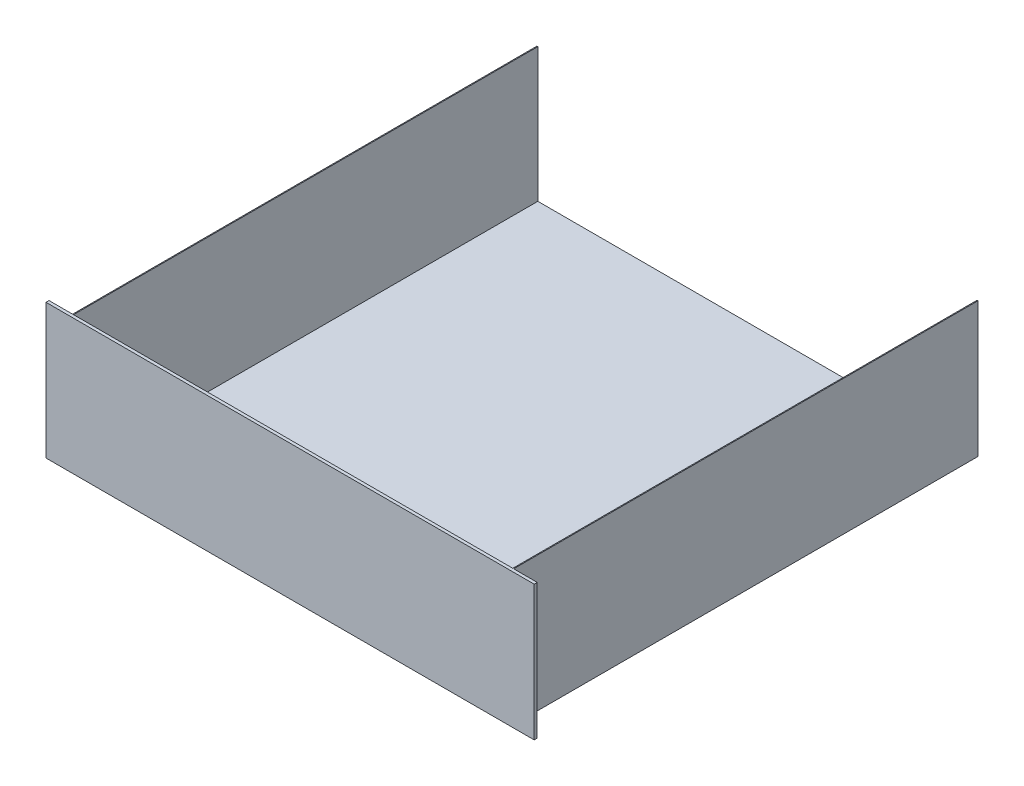
ISO-10303-21;
HEADER;
FILE_DESCRIPTION(('STEP AP214'),'2;1');
FILE_NAME('part.step','',(''),(''),'','','');
FILE_SCHEMA(('AUTOMOTIVE_DESIGN { 1 0 10303 214 1 1 1 1 }'));
ENDSEC;
DATA;
#1=APPLICATION_CONTEXT('core data for automotive mechanical design processes');
#2=APPLICATION_PROTOCOL_DEFINITION('international standard','automotive_design',2000,#1);
#3=PRODUCT_CONTEXT('',#1,'mechanical');
#4=PRODUCT('Part','Part','',(#3));
#5=PRODUCT_RELATED_PRODUCT_CATEGORY('part','',(#4));
#6=PRODUCT_DEFINITION_FORMATION('','',#4);
#7=PRODUCT_DEFINITION_CONTEXT('part definition',#1,'design');
#8=PRODUCT_DEFINITION('design','',#6,#7);
#9=PRODUCT_DEFINITION_SHAPE('','',#8);
#10=(LENGTH_UNIT() NAMED_UNIT(*) SI_UNIT(.MILLI.,.METRE.));
#11=(NAMED_UNIT(*) PLANE_ANGLE_UNIT() SI_UNIT($,.RADIAN.));
#12=(NAMED_UNIT(*) SI_UNIT($,.STERADIAN.) SOLID_ANGLE_UNIT());
#13=UNCERTAINTY_MEASURE_WITH_UNIT(LENGTH_MEASURE(1.E-05),#10,'distance_accuracy_value','');
#14=(GEOMETRIC_REPRESENTATION_CONTEXT(3) GLOBAL_UNCERTAINTY_ASSIGNED_CONTEXT((#13)) GLOBAL_UNIT_ASSIGNED_CONTEXT((#10,
#11,#12)) REPRESENTATION_CONTEXT('',''));
#15=CARTESIAN_POINT('',(0.,0.,0.));
#16=DIRECTION('',(0.,0.,1.));
#17=DIRECTION('',(1.,0.,0.));
#18=AXIS2_PLACEMENT_3D('',#15,#16,#17);
#19=CARTESIAN_POINT('',(0.,0.,0.));
#20=DIRECTION('',(0.,0.,1.));
#21=DIRECTION('',(1.,0.,0.));
#22=AXIS2_PLACEMENT_3D('',#19,#20,#21);
#23=PLANE('',#22);
#24=DIRECTION('',(0.,1.,0.));
#25=VECTOR('',#24,1.);
#26=CARTESIAN_POINT('',(217.1,66.675,0.));
#27=LINE('',#26,#25);
#28=CARTESIAN_POINT('',(217.1,-65.775,0.));
#29=VERTEX_POINT('',#28);
#30=CARTESIAN_POINT('',(217.1,66.675,0.));
#31=VERTEX_POINT('',#30);
#32=EDGE_CURVE('E56',#29,#31,#27,.T.);
#33=ORIENTED_EDGE('',*,*,#32,.F.);
#34=DIRECTION('',(1.,0.,0.));
#35=VECTOR('',#34,1.);
#36=CARTESIAN_POINT('',(217.1,-65.775,0.));
#37=LINE('',#36,#35);
#38=CARTESIAN_POINT('',(-217.1,-65.775,0.));
#39=VERTEX_POINT('',#38);
#40=EDGE_CURVE('E60',#39,#29,#37,.T.);
#41=ORIENTED_EDGE('',*,*,#40,.F.);
#42=DIRECTION('',(0.,-1.,0.));
#43=VECTOR('',#42,1.);
#44=CARTESIAN_POINT('',(-217.1,-65.775,0.));
#45=LINE('',#44,#43);
#46=CARTESIAN_POINT('',(-217.1,66.675,0.));
#47=VERTEX_POINT('',#46);
#48=EDGE_CURVE('E254',#47,#39,#45,.T.);
#49=ORIENTED_EDGE('',*,*,#48,.F.);
#50=DIRECTION('',(-1.,0.,0.));
#51=VECTOR('',#50,1.);
#52=CARTESIAN_POINT('',(-241.3,66.675,0.));
#53=LINE('',#52,#51);
#54=EDGE_CURVE('E208',#31,#47,#53,.T.);
#55=ORIENTED_EDGE('',*,*,#54,.F.);
#56=EDGE_LOOP('',(#33,#41,#49,#55));
#57=FACE_BOUND('',#56,.T.);
#58=ADVANCED_FACE('F39',(#57),#23,.F.);
#59=DIRECTION('',(0.,1.,0.));
#60=VECTOR('',#59,1.);
#61=CARTESIAN_POINT('',(-218.,-66.675,0.));
#62=LINE('',#61,#60);
#63=CARTESIAN_POINT('',(-218.,-66.675,0.));
#64=VERTEX_POINT('',#63);
#65=CARTESIAN_POINT('',(-218.,66.675,0.));
#66=VERTEX_POINT('',#65);
#67=EDGE_CURVE('E253',#64,#66,#62,.T.);
#68=ORIENTED_EDGE('',*,*,#67,.F.);
#69=DIRECTION('',(1.,0.,0.));
#70=VECTOR('',#69,1.);
#71=CARTESIAN_POINT('',(-241.3,-66.675,0.));
#72=LINE('',#71,#70);
#73=CARTESIAN_POINT('',(-241.3,-66.675,0.));
#74=VERTEX_POINT('',#73);
#75=EDGE_CURVE('E189',#74,#64,#72,.T.);
#76=ORIENTED_EDGE('',*,*,#75,.F.);
#77=DIRECTION('',(0.,-1.,0.));
#78=VECTOR('',#77,1.);
#79=CARTESIAN_POINT('',(-241.3,66.675,0.));
#80=LINE('',#79,#78);
#81=CARTESIAN_POINT('',(-241.3,66.675,0.));
#82=VERTEX_POINT('',#81);
#83=EDGE_CURVE('E199',#82,#74,#80,.T.);
#84=ORIENTED_EDGE('',*,*,#83,.F.);
#85=EDGE_CURVE('E160',#66,#82,#53,.T.);
#86=ORIENTED_EDGE('',*,*,#85,.F.);
#87=EDGE_LOOP('',(#68,#76,#84,#86));
#88=FACE_BOUND('',#87,.T.);
#89=ADVANCED_FACE('F231',(#88),#23,.F.);
#90=DIRECTION('',(0.,-1.,0.));
#91=VECTOR('',#90,1.);
#92=CARTESIAN_POINT('',(218.,66.675,0.));
#93=LINE('',#92,#91);
#94=CARTESIAN_POINT('',(218.,66.675,0.));
#95=VERTEX_POINT('',#94);
#96=CARTESIAN_POINT('',(218.,-66.675,0.));
#97=VERTEX_POINT('',#96);
#98=EDGE_CURVE('E252',#95,#97,#93,.T.);
#99=ORIENTED_EDGE('',*,*,#98,.F.);
#100=CARTESIAN_POINT('',(241.3,66.675,0.));
#101=VERTEX_POINT('',#100);
#102=EDGE_CURVE('E156',#101,#95,#53,.T.);
#103=ORIENTED_EDGE('',*,*,#102,.F.);
#104=DIRECTION('',(0.,1.,0.));
#105=VECTOR('',#104,1.);
#106=CARTESIAN_POINT('',(241.3,66.675,0.));
#107=LINE('',#106,#105);
#108=CARTESIAN_POINT('',(241.3,-66.675,0.));
#109=VERTEX_POINT('',#108);
#110=EDGE_CURVE('E157',#109,#101,#107,.T.);
#111=ORIENTED_EDGE('',*,*,#110,.F.);
#112=EDGE_CURVE('E209',#97,#109,#72,.T.);
#113=ORIENTED_EDGE('',*,*,#112,.F.);
#114=EDGE_LOOP('',(#99,#103,#111,#113));
#115=FACE_BOUND('',#114,.T.);
#116=ADVANCED_FACE('F251',(#115),#23,.F.);
#117=CARTESIAN_POINT('',(241.3,66.675,3.));
#118=DIRECTION('',(-1.,0.,0.));
#119=DIRECTION('',(0.,-1.,0.));
#120=AXIS2_PLACEMENT_3D('',#117,#118,#119);
#121=PLANE('',#120);
#122=ORIENTED_EDGE('',*,*,#110,.T.);
#123=DIRECTION('',(0.,0.,-1.));
#124=VECTOR('',#123,1.);
#125=CARTESIAN_POINT('',(241.3,66.675,3.));
#126=LINE('',#125,#124);
#127=CARTESIAN_POINT('',(241.3,66.675,3.));
#128=VERTEX_POINT('',#127);
#129=EDGE_CURVE('E11',#128,#101,#126,.T.);
#130=ORIENTED_EDGE('',*,*,#129,.F.);
#131=DIRECTION('',(0.,1.,0.));
#132=VECTOR('',#131,1.);
#133=CARTESIAN_POINT('',(241.3,66.675,3.));
#134=LINE('',#133,#132);
#135=CARTESIAN_POINT('',(241.3,-66.675,3.));
#136=VERTEX_POINT('',#135);
#137=EDGE_CURVE('E185',#136,#128,#134,.T.);
#138=ORIENTED_EDGE('',*,*,#137,.F.);
#139=DIRECTION('',(0.,0.,-1.));
#140=VECTOR('',#139,1.);
#141=CARTESIAN_POINT('',(241.3,-66.675,3.));
#142=LINE('',#141,#140);
#143=EDGE_CURVE('E195',#136,#109,#142,.T.);
#144=ORIENTED_EDGE('',*,*,#143,.T.);
#145=EDGE_LOOP('',(#122,#130,#138,#144));
#146=FACE_BOUND('',#145,.T.);
#147=ADVANCED_FACE('F41',(#146),#121,.F.);
#148=CARTESIAN_POINT('',(-241.3,66.675,3.));
#149=DIRECTION('',(0.,-1.,0.));
#150=DIRECTION('',(0.,0.,-1.));
#151=AXIS2_PLACEMENT_3D('',#148,#149,#150);
#152=PLANE('',#151);
#153=ORIENTED_EDGE('',*,*,#102,.T.);
#154=DIRECTION('',(0.,0.,1.));
#155=VECTOR('',#154,1.);
#156=CARTESIAN_POINT('',(218.,66.675,-459.));
#157=LINE('',#156,#155);
#158=CARTESIAN_POINT('',(218.,66.675,-459.));
#159=VERTEX_POINT('',#158);
#160=EDGE_CURVE('E137',#159,#95,#157,.T.);
#161=ORIENTED_EDGE('',*,*,#160,.F.);
#162=DIRECTION('',(1.,0.,0.));
#163=VECTOR('',#162,1.);
#164=CARTESIAN_POINT('',(218.,66.675,-459.));
#165=LINE('',#164,#163);
#166=CARTESIAN_POINT('',(217.1,66.675,-459.));
#167=VERTEX_POINT('',#166);
#168=EDGE_CURVE('E144',#167,#159,#165,.T.);
#169=ORIENTED_EDGE('',*,*,#168,.F.);
#170=DIRECTION('',(0.,0.,1.));
#171=VECTOR('',#170,1.);
#172=CARTESIAN_POINT('',(217.1,66.675,-459.));
#173=LINE('',#172,#171);
#174=EDGE_CURVE('E171',#167,#31,#173,.T.);
#175=ORIENTED_EDGE('',*,*,#174,.T.);
#176=ORIENTED_EDGE('',*,*,#54,.T.);
#177=DIRECTION('',(0.,0.,1.));
#178=VECTOR('',#177,1.);
#179=CARTESIAN_POINT('',(-217.1,66.675,-459.));
#180=LINE('',#179,#178);
#181=CARTESIAN_POINT('',(-217.1,66.675,-459.));
#182=VERTEX_POINT('',#181);
#183=EDGE_CURVE('E184',#182,#47,#180,.T.);
#184=ORIENTED_EDGE('',*,*,#183,.F.);
#185=DIRECTION('',(1.,0.,0.));
#186=VECTOR('',#185,1.);
#187=CARTESIAN_POINT('',(-217.1,66.675,-459.));
#188=LINE('',#187,#186);
#189=CARTESIAN_POINT('',(-218.,66.675,-459.));
#190=VERTEX_POINT('',#189);
#191=EDGE_CURVE('E278',#190,#182,#188,.T.);
#192=ORIENTED_EDGE('',*,*,#191,.F.);
#193=DIRECTION('',(0.,0.,1.));
#194=VECTOR('',#193,1.);
#195=CARTESIAN_POINT('',(-218.,66.675,-459.));
#196=LINE('',#195,#194);
#197=EDGE_CURVE('E220',#190,#66,#196,.T.);
#198=ORIENTED_EDGE('',*,*,#197,.T.);
#199=ORIENTED_EDGE('',*,*,#85,.T.);
#200=DIRECTION('',(0.,0.,-1.));
#201=VECTOR('',#200,1.);
#202=CARTESIAN_POINT('',(-241.3,66.675,3.));
#203=LINE('',#202,#201);
#204=CARTESIAN_POINT('',(-241.3,66.675,3.));
#205=VERTEX_POINT('',#204);
#206=EDGE_CURVE('E48',#205,#82,#203,.T.);
#207=ORIENTED_EDGE('',*,*,#206,.F.);
#208=DIRECTION('',(-1.,0.,0.));
#209=VECTOR('',#208,1.);
#210=CARTESIAN_POINT('',(-241.3,66.675,3.));
#211=LINE('',#210,#209);
#212=EDGE_CURVE('E188',#128,#205,#211,.T.);
#213=ORIENTED_EDGE('',*,*,#212,.F.);
#214=ORIENTED_EDGE('',*,*,#129,.T.);
#215=EDGE_LOOP('',(#153,#161,#169,#175,#176,#184,#192,#198,#199,#207,#213,#214));
#216=FACE_BOUND('',#215,.T.);
#217=ADVANCED_FACE('F155',(#216),#152,.F.);
#218=CARTESIAN_POINT('',(-241.3,66.675,3.));
#219=DIRECTION('',(1.,0.,0.));
#220=DIRECTION('',(0.,0.,-1.));
#221=AXIS2_PLACEMENT_3D('',#218,#219,#220);
#222=PLANE('',#221);
#223=ORIENTED_EDGE('',*,*,#83,.T.);
#224=DIRECTION('',(0.,0.,-1.));
#225=VECTOR('',#224,1.);
#226=CARTESIAN_POINT('',(-241.3,-66.675,3.));
#227=LINE('',#226,#225);
#228=CARTESIAN_POINT('',(-241.3,-66.675,3.));
#229=VERTEX_POINT('',#228);
#230=EDGE_CURVE('E228',#229,#74,#227,.T.);
#231=ORIENTED_EDGE('',*,*,#230,.F.);
#232=DIRECTION('',(0.,-1.,0.));
#233=VECTOR('',#232,1.);
#234=CARTESIAN_POINT('',(-241.3,66.675,3.));
#235=LINE('',#234,#233);
#236=EDGE_CURVE('E191',#205,#229,#235,.T.);
#237=ORIENTED_EDGE('',*,*,#236,.F.);
#238=ORIENTED_EDGE('',*,*,#206,.T.);
#239=EDGE_LOOP('',(#223,#231,#237,#238));
#240=FACE_BOUND('',#239,.T.);
#241=ADVANCED_FACE('F225',(#240),#222,.F.);
#242=CARTESIAN_POINT('',(-241.3,-66.675,3.));
#243=DIRECTION('',(0.,1.,0.));
#244=DIRECTION('',(0.,0.,1.));
#245=AXIS2_PLACEMENT_3D('',#242,#243,#244);
#246=PLANE('',#245);
#247=ORIENTED_EDGE('',*,*,#75,.T.);
#248=DIRECTION('',(0.,0.,1.));
#249=VECTOR('',#248,1.);
#250=CARTESIAN_POINT('',(-218.,-66.675,-459.));
#251=LINE('',#250,#249);
#252=CARTESIAN_POINT('',(-218.,-66.675,-459.));
#253=VERTEX_POINT('',#252);
#254=EDGE_CURVE('E162',#253,#64,#251,.T.);
#255=ORIENTED_EDGE('',*,*,#254,.F.);
#256=DIRECTION('',(-1.,0.,0.));
#257=VECTOR('',#256,1.);
#258=CARTESIAN_POINT('',(218.,-66.675,-459.));
#259=LINE('',#258,#257);
#260=CARTESIAN_POINT('',(218.,-66.675,-459.));
#261=VERTEX_POINT('',#260);
#262=EDGE_CURVE('E143',#261,#253,#259,.T.);
#263=ORIENTED_EDGE('',*,*,#262,.F.);
#264=DIRECTION('',(0.,0.,1.));
#265=VECTOR('',#264,1.);
#266=CARTESIAN_POINT('',(218.,-66.675,-459.));
#267=LINE('',#266,#265);
#268=EDGE_CURVE('E139',#261,#97,#267,.T.);
#269=ORIENTED_EDGE('',*,*,#268,.T.);
#270=ORIENTED_EDGE('',*,*,#112,.T.);
#271=ORIENTED_EDGE('',*,*,#143,.F.);
#272=DIRECTION('',(1.,0.,0.));
#273=VECTOR('',#272,1.);
#274=CARTESIAN_POINT('',(-241.3,-66.675,3.));
#275=LINE('',#274,#273);
#276=EDGE_CURVE('E193',#229,#136,#275,.T.);
#277=ORIENTED_EDGE('',*,*,#276,.F.);
#278=ORIENTED_EDGE('',*,*,#230,.T.);
#279=EDGE_LOOP('',(#247,#255,#263,#269,#270,#271,#277,#278));
#280=FACE_BOUND('',#279,.T.);
#281=ADVANCED_FACE('F243',(#280),#246,.F.);
#282=CARTESIAN_POINT('',(0.,0.,3.));
#283=DIRECTION('',(0.,0.,1.));
#284=DIRECTION('',(1.,0.,0.));
#285=AXIS2_PLACEMENT_3D('',#282,#283,#284);
#286=PLANE('',#285);
#287=ORIENTED_EDGE('',*,*,#137,.T.);
#288=ORIENTED_EDGE('',*,*,#212,.T.);
#289=ORIENTED_EDGE('',*,*,#236,.T.);
#290=ORIENTED_EDGE('',*,*,#276,.T.);
#291=EDGE_LOOP('',(#287,#288,#289,#290));
#292=FACE_BOUND('',#291,.T.);
#293=ADVANCED_FACE('F246',(#292),#286,.T.);
#294=CARTESIAN_POINT('',(218.,66.675,-459.));
#295=DIRECTION('',(-1.,0.,0.));
#296=DIRECTION('',(0.,-1.,0.));
#297=AXIS2_PLACEMENT_3D('',#294,#295,#296);
#298=PLANE('',#297);
#299=ORIENTED_EDGE('',*,*,#98,.T.);
#300=ORIENTED_EDGE('',*,*,#268,.F.);
#301=DIRECTION('',(0.,-1.,0.));
#302=VECTOR('',#301,1.);
#303=CARTESIAN_POINT('',(218.,66.675,-459.));
#304=LINE('',#303,#302);
#305=EDGE_CURVE('E132',#159,#261,#304,.T.);
#306=ORIENTED_EDGE('',*,*,#305,.F.);
#307=ORIENTED_EDGE('',*,*,#160,.T.);
#308=EDGE_LOOP('',(#299,#300,#306,#307));
#309=FACE_BOUND('',#308,.T.);
#310=ADVANCED_FACE('F135',(#309),#298,.F.);
#311=CARTESIAN_POINT('',(-218.,-66.675,-459.));
#312=DIRECTION('',(1.,0.,0.));
#313=DIRECTION('',(0.,1.,0.));
#314=AXIS2_PLACEMENT_3D('',#311,#312,#313);
#315=PLANE('',#314);
#316=ORIENTED_EDGE('',*,*,#67,.T.);
#317=ORIENTED_EDGE('',*,*,#197,.F.);
#318=DIRECTION('',(0.,1.,0.));
#319=VECTOR('',#318,1.);
#320=CARTESIAN_POINT('',(-218.,-66.675,-459.));
#321=LINE('',#320,#319);
#322=EDGE_CURVE('E273',#253,#190,#321,.T.);
#323=ORIENTED_EDGE('',*,*,#322,.F.);
#324=ORIENTED_EDGE('',*,*,#254,.T.);
#325=EDGE_LOOP('',(#316,#317,#323,#324));
#326=FACE_BOUND('',#325,.T.);
#327=ADVANCED_FACE('F272',(#326),#315,.F.);
#328=CARTESIAN_POINT('',(-217.1,-65.775,-459.));
#329=DIRECTION('',(-1.,0.,0.));
#330=DIRECTION('',(0.,0.,1.));
#331=AXIS2_PLACEMENT_3D('',#328,#329,#330);
#332=PLANE('',#331);
#333=ORIENTED_EDGE('',*,*,#48,.T.);
#334=DIRECTION('',(0.,0.,1.));
#335=VECTOR('',#334,1.);
#336=CARTESIAN_POINT('',(-217.1,-65.775,-459.));
#337=LINE('',#336,#335);
#338=CARTESIAN_POINT('',(-217.1,-65.775,-459.));
#339=VERTEX_POINT('',#338);
#340=EDGE_CURVE('E180',#339,#39,#337,.T.);
#341=ORIENTED_EDGE('',*,*,#340,.F.);
#342=DIRECTION('',(0.,-1.,0.));
#343=VECTOR('',#342,1.);
#344=CARTESIAN_POINT('',(-217.1,-65.775,-459.));
#345=LINE('',#344,#343);
#346=EDGE_CURVE('E282',#182,#339,#345,.T.);
#347=ORIENTED_EDGE('',*,*,#346,.F.);
#348=ORIENTED_EDGE('',*,*,#183,.T.);
#349=EDGE_LOOP('',(#333,#341,#347,#348));
#350=FACE_BOUND('',#349,.T.);
#351=ADVANCED_FACE('F301',(#350),#332,.F.);
#352=CARTESIAN_POINT('',(217.1,-65.775,-459.));
#353=DIRECTION('',(0.,-1.,0.));
#354=DIRECTION('',(0.,0.,-1.));
#355=AXIS2_PLACEMENT_3D('',#352,#353,#354);
#356=PLANE('',#355);
#357=ORIENTED_EDGE('',*,*,#40,.T.);
#358=DIRECTION('',(0.,0.,1.));
#359=VECTOR('',#358,1.);
#360=CARTESIAN_POINT('',(217.1,-65.775,-459.));
#361=LINE('',#360,#359);
#362=CARTESIAN_POINT('',(217.1,-65.775,-459.));
#363=VERTEX_POINT('',#362);
#364=EDGE_CURVE('E177',#363,#29,#361,.T.);
#365=ORIENTED_EDGE('',*,*,#364,.F.);
#366=DIRECTION('',(1.,0.,0.));
#367=VECTOR('',#366,1.);
#368=CARTESIAN_POINT('',(217.1,-65.775,-459.));
#369=LINE('',#368,#367);
#370=EDGE_CURVE('E284',#339,#363,#369,.T.);
#371=ORIENTED_EDGE('',*,*,#370,.F.);
#372=ORIENTED_EDGE('',*,*,#340,.T.);
#373=EDGE_LOOP('',(#357,#365,#371,#372));
#374=FACE_BOUND('',#373,.T.);
#375=ADVANCED_FACE('F291',(#374),#356,.F.);
#376=CARTESIAN_POINT('',(217.1,66.675,-459.));
#377=DIRECTION('',(1.,0.,0.));
#378=DIRECTION('',(0.,1.,0.));
#379=AXIS2_PLACEMENT_3D('',#376,#377,#378);
#380=PLANE('',#379);
#381=ORIENTED_EDGE('',*,*,#32,.T.);
#382=ORIENTED_EDGE('',*,*,#174,.F.);
#383=DIRECTION('',(0.,1.,0.));
#384=VECTOR('',#383,1.);
#385=CARTESIAN_POINT('',(217.1,66.675,-459.));
#386=LINE('',#385,#384);
#387=EDGE_CURVE('E149',#363,#167,#386,.T.);
#388=ORIENTED_EDGE('',*,*,#387,.F.);
#389=ORIENTED_EDGE('',*,*,#364,.T.);
#390=EDGE_LOOP('',(#381,#382,#388,#389));
#391=FACE_BOUND('',#390,.T.);
#392=ADVANCED_FACE('F289',(#391),#380,.F.);
#393=CARTESIAN_POINT('',(0.,0.,-459.));
#394=DIRECTION('',(0.,0.,1.));
#395=DIRECTION('',(1.,0.,0.));
#396=AXIS2_PLACEMENT_3D('',#393,#394,#395);
#397=PLANE('',#396);
#398=ORIENTED_EDGE('',*,*,#168,.T.);
#399=ORIENTED_EDGE('',*,*,#305,.T.);
#400=ORIENTED_EDGE('',*,*,#262,.T.);
#401=ORIENTED_EDGE('',*,*,#322,.T.);
#402=ORIENTED_EDGE('',*,*,#191,.T.);
#403=ORIENTED_EDGE('',*,*,#346,.T.);
#404=ORIENTED_EDGE('',*,*,#370,.T.);
#405=ORIENTED_EDGE('',*,*,#387,.T.);
#406=EDGE_LOOP('',(#398,#399,#400,#401,#402,#403,#404,#405));
#407=FACE_BOUND('',#406,.T.);
#408=ADVANCED_FACE('F147',(#407),#397,.F.);
#409=CLOSED_SHELL('',(#58,#89,#116,#147,#217,#241,#281,#293,#310,#327,#351,#375,#392,#408));
#410=MANIFOLD_SOLID_BREP('B2',#409);
#411=ADVANCED_BREP_SHAPE_REPRESENTATION('',(#18,#410),#14);
#412=SHAPE_DEFINITION_REPRESENTATION(#9,#411);
ENDSEC;
END-ISO-10303-21;
